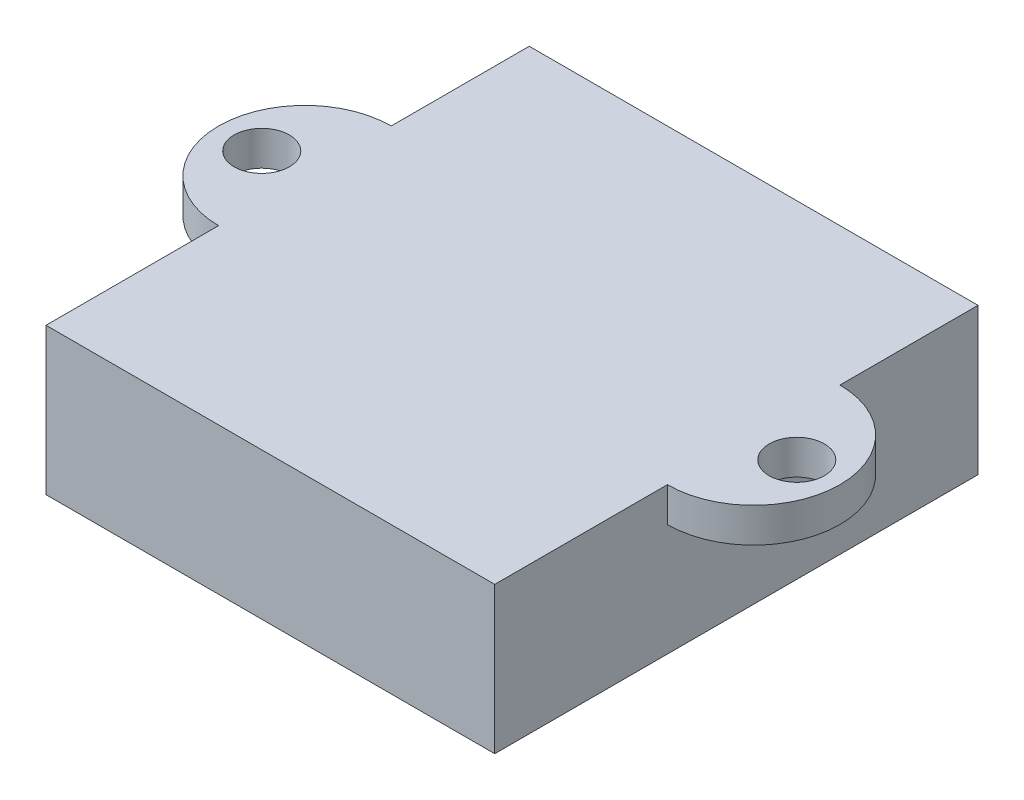
ISO-10303-21;
HEADER;
FILE_DESCRIPTION(('STEP AP214'),'2;1');
FILE_NAME('part.step','',(''),(''),'','','');
FILE_SCHEMA(('AUTOMOTIVE_DESIGN { 1 0 10303 214 1 1 1 1 }'));
ENDSEC;
DATA;
#1=APPLICATION_CONTEXT('core data for automotive mechanical design processes');
#2=APPLICATION_PROTOCOL_DEFINITION('international standard','automotive_design',2000,#1);
#3=PRODUCT_CONTEXT('',#1,'mechanical');
#4=PRODUCT('Part','Part','',(#3));
#5=PRODUCT_RELATED_PRODUCT_CATEGORY('part','',(#4));
#6=PRODUCT_DEFINITION_FORMATION('','',#4);
#7=PRODUCT_DEFINITION_CONTEXT('part definition',#1,'design');
#8=PRODUCT_DEFINITION('design','',#6,#7);
#9=PRODUCT_DEFINITION_SHAPE('','',#8);
#10=(LENGTH_UNIT() NAMED_UNIT(*) SI_UNIT(.MILLI.,.METRE.));
#11=(NAMED_UNIT(*) PLANE_ANGLE_UNIT() SI_UNIT($,.RADIAN.));
#12=(NAMED_UNIT(*) SI_UNIT($,.STERADIAN.) SOLID_ANGLE_UNIT());
#13=UNCERTAINTY_MEASURE_WITH_UNIT(LENGTH_MEASURE(1.E-05),#10,'distance_accuracy_value','');
#14=(GEOMETRIC_REPRESENTATION_CONTEXT(3) GLOBAL_UNCERTAINTY_ASSIGNED_CONTEXT((#13)) GLOBAL_UNIT_ASSIGNED_CONTEXT((#10,
#11,#12)) REPRESENTATION_CONTEXT('',''));
#15=CARTESIAN_POINT('',(0.,0.,0.));
#16=DIRECTION('',(0.,0.,1.));
#17=DIRECTION('',(1.,0.,0.));
#18=AXIS2_PLACEMENT_3D('',#15,#16,#17);
#19=CARTESIAN_POINT('',(13.,8.5,14.));
#20=DIRECTION('',(-1.,0.,0.));
#21=DIRECTION('',(0.,0.,1.));
#22=AXIS2_PLACEMENT_3D('',#19,#20,#21);
#23=PLANE('',#22);
#24=DIRECTION('',(0.,0.,-1.));
#25=VECTOR('',#24,1.);
#26=CARTESIAN_POINT('',(13.,6.5,14.));
#27=LINE('',#26,#25);
#28=CARTESIAN_POINT('',(13.,6.5,4.));
#29=VERTEX_POINT('',#28);
#30=CARTESIAN_POINT('',(13.,6.5,-6.));
#31=VERTEX_POINT('',#30);
#32=EDGE_CURVE('E11',#29,#31,#27,.T.);
#33=ORIENTED_EDGE('',*,*,#32,.F.);
#34=DIRECTION('',(0.,1.,0.));
#35=VECTOR('',#34,1.);
#36=CARTESIAN_POINT('',(13.,6.5,4.));
#37=LINE('',#36,#35);
#38=CARTESIAN_POINT('',(13.,8.5,4.));
#39=VERTEX_POINT('',#38);
#40=EDGE_CURVE('E103',#29,#39,#37,.T.);
#41=ORIENTED_EDGE('',*,*,#40,.T.);
#42=DIRECTION('',(0.,0.,-1.));
#43=VECTOR('',#42,1.);
#44=CARTESIAN_POINT('',(13.,8.5,14.));
#45=LINE('',#44,#43);
#46=CARTESIAN_POINT('',(13.,8.5,14.));
#47=VERTEX_POINT('',#46);
#48=EDGE_CURVE('E134',#47,#39,#45,.T.);
#49=ORIENTED_EDGE('',*,*,#48,.F.);
#50=DIRECTION('',(0.,-1.,0.));
#51=VECTOR('',#50,1.);
#52=CARTESIAN_POINT('',(13.,8.5,14.));
#53=LINE('',#52,#51);
#54=CARTESIAN_POINT('',(13.,0.,14.));
#55=VERTEX_POINT('',#54);
#56=EDGE_CURVE('E143',#47,#55,#53,.T.);
#57=ORIENTED_EDGE('',*,*,#56,.T.);
#58=DIRECTION('',(0.,0.,-1.));
#59=VECTOR('',#58,1.);
#60=CARTESIAN_POINT('',(13.,0.,14.));
#61=LINE('',#60,#59);
#62=CARTESIAN_POINT('',(13.,0.,-14.));
#63=VERTEX_POINT('',#62);
#64=EDGE_CURVE('E133',#55,#63,#61,.T.);
#65=ORIENTED_EDGE('',*,*,#64,.T.);
#66=DIRECTION('',(0.,-1.,0.));
#67=VECTOR('',#66,1.);
#68=CARTESIAN_POINT('',(13.,8.5,-14.));
#69=LINE('',#68,#67);
#70=CARTESIAN_POINT('',(13.,8.5,-14.));
#71=VERTEX_POINT('',#70);
#72=EDGE_CURVE('E160',#71,#63,#69,.T.);
#73=ORIENTED_EDGE('',*,*,#72,.F.);
#74=CARTESIAN_POINT('',(13.,8.5,-6.));
#75=VERTEX_POINT('',#74);
#76=EDGE_CURVE('E119',#75,#71,#45,.T.);
#77=ORIENTED_EDGE('',*,*,#76,.F.);
#78=DIRECTION('',(0.,1.,0.));
#79=VECTOR('',#78,1.);
#80=CARTESIAN_POINT('',(13.,6.5,-6.));
#81=LINE('',#80,#79);
#82=EDGE_CURVE('E111',#75,#31,#81,.F.);
#83=ORIENTED_EDGE('',*,*,#82,.T.);
#84=EDGE_LOOP('',(#33,#41,#49,#57,#65,#73,#77,#83));
#85=FACE_BOUND('',#84,.T.);
#86=ADVANCED_FACE('F39',(#85),#23,.F.);
#87=CARTESIAN_POINT('',(-13.,8.5,-14.));
#88=DIRECTION('',(0.,0.,1.));
#89=DIRECTION('',(1.,0.,0.));
#90=AXIS2_PLACEMENT_3D('',#87,#88,#89);
#91=PLANE('',#90);
#92=DIRECTION('',(-1.,0.,0.));
#93=VECTOR('',#92,1.);
#94=CARTESIAN_POINT('',(-13.,0.,-14.));
#95=LINE('',#94,#93);
#96=CARTESIAN_POINT('',(-13.,0.,-14.));
#97=VERTEX_POINT('',#96);
#98=EDGE_CURVE('E146',#63,#97,#95,.T.);
#99=ORIENTED_EDGE('',*,*,#98,.T.);
#100=DIRECTION('',(0.,-1.,0.));
#101=VECTOR('',#100,1.);
#102=CARTESIAN_POINT('',(-13.,8.5,-14.));
#103=LINE('',#102,#101);
#104=CARTESIAN_POINT('',(-13.,8.5,-14.));
#105=VERTEX_POINT('',#104);
#106=EDGE_CURVE('E157',#105,#97,#103,.T.);
#107=ORIENTED_EDGE('',*,*,#106,.F.);
#108=DIRECTION('',(-1.,0.,0.));
#109=VECTOR('',#108,1.);
#110=CARTESIAN_POINT('',(-13.,8.5,-14.));
#111=LINE('',#110,#109);
#112=EDGE_CURVE('E136',#71,#105,#111,.T.);
#113=ORIENTED_EDGE('',*,*,#112,.F.);
#114=ORIENTED_EDGE('',*,*,#72,.T.);
#115=EDGE_LOOP('',(#99,#107,#113,#114));
#116=FACE_BOUND('',#115,.T.);
#117=ADVANCED_FACE('F196',(#116),#91,.F.);
#118=CARTESIAN_POINT('',(-13.,8.5,14.));
#119=DIRECTION('',(1.,0.,0.));
#120=DIRECTION('',(0.,0.,-1.));
#121=AXIS2_PLACEMENT_3D('',#118,#119,#120);
#122=PLANE('',#121);
#123=DIRECTION('',(0.,0.,1.));
#124=VECTOR('',#123,1.);
#125=CARTESIAN_POINT('',(-13.,6.5,14.));
#126=LINE('',#125,#124);
#127=CARTESIAN_POINT('',(-13.,6.5,-6.));
#128=VERTEX_POINT('',#127);
#129=CARTESIAN_POINT('',(-13.,6.5,4.));
#130=VERTEX_POINT('',#129);
#131=EDGE_CURVE('E47',#128,#130,#126,.T.);
#132=ORIENTED_EDGE('',*,*,#131,.F.);
#133=DIRECTION('',(0.,1.,0.));
#134=VECTOR('',#133,1.);
#135=CARTESIAN_POINT('',(-13.,6.5,-6.));
#136=LINE('',#135,#134);
#137=CARTESIAN_POINT('',(-13.,8.5,-6.));
#138=VERTEX_POINT('',#137);
#139=EDGE_CURVE('E130',#128,#138,#136,.T.);
#140=ORIENTED_EDGE('',*,*,#139,.T.);
#141=DIRECTION('',(0.,0.,1.));
#142=VECTOR('',#141,1.);
#143=CARTESIAN_POINT('',(-13.,8.5,14.));
#144=LINE('',#143,#142);
#145=EDGE_CURVE('E139',#105,#138,#144,.T.);
#146=ORIENTED_EDGE('',*,*,#145,.F.);
#147=ORIENTED_EDGE('',*,*,#106,.T.);
#148=DIRECTION('',(0.,0.,1.));
#149=VECTOR('',#148,1.);
#150=CARTESIAN_POINT('',(-13.,0.,14.));
#151=LINE('',#150,#149);
#152=CARTESIAN_POINT('',(-13.,0.,14.));
#153=VERTEX_POINT('',#152);
#154=EDGE_CURVE('E148',#97,#153,#151,.T.);
#155=ORIENTED_EDGE('',*,*,#154,.T.);
#156=DIRECTION('',(0.,-1.,0.));
#157=VECTOR('',#156,1.);
#158=CARTESIAN_POINT('',(-13.,8.5,14.));
#159=LINE('',#158,#157);
#160=CARTESIAN_POINT('',(-13.,8.5,14.));
#161=VERTEX_POINT('',#160);
#162=EDGE_CURVE('E154',#161,#153,#159,.T.);
#163=ORIENTED_EDGE('',*,*,#162,.F.);
#164=CARTESIAN_POINT('',(-13.,8.5,4.));
#165=VERTEX_POINT('',#164);
#166=EDGE_CURVE('E138',#165,#161,#144,.T.);
#167=ORIENTED_EDGE('',*,*,#166,.F.);
#168=DIRECTION('',(0.,1.,0.));
#169=VECTOR('',#168,1.);
#170=CARTESIAN_POINT('',(-13.,6.5,4.));
#171=LINE('',#170,#169);
#172=EDGE_CURVE('E126',#165,#130,#171,.F.);
#173=ORIENTED_EDGE('',*,*,#172,.T.);
#174=EDGE_LOOP('',(#132,#140,#146,#147,#155,#163,#167,#173));
#175=FACE_BOUND('',#174,.T.);
#176=ADVANCED_FACE('F200',(#175),#122,.F.);
#177=CARTESIAN_POINT('',(-13.,8.5,14.));
#178=DIRECTION('',(0.,0.,-1.));
#179=DIRECTION('',(-1.,0.,0.));
#180=AXIS2_PLACEMENT_3D('',#177,#178,#179);
#181=PLANE('',#180);
#182=DIRECTION('',(1.,0.,0.));
#183=VECTOR('',#182,1.);
#184=CARTESIAN_POINT('',(-13.,0.,14.));
#185=LINE('',#184,#183);
#186=EDGE_CURVE('E150',#153,#55,#185,.T.);
#187=ORIENTED_EDGE('',*,*,#186,.T.);
#188=ORIENTED_EDGE('',*,*,#56,.F.);
#189=DIRECTION('',(1.,0.,0.));
#190=VECTOR('',#189,1.);
#191=CARTESIAN_POINT('',(-13.,8.5,14.));
#192=LINE('',#191,#190);
#193=EDGE_CURVE('E141',#161,#47,#192,.T.);
#194=ORIENTED_EDGE('',*,*,#193,.F.);
#195=ORIENTED_EDGE('',*,*,#162,.T.);
#196=EDGE_LOOP('',(#187,#188,#194,#195));
#197=FACE_BOUND('',#196,.T.);
#198=ADVANCED_FACE('F184',(#197),#181,.F.);
#199=CARTESIAN_POINT('',(0.,8.5,0.));
#200=DIRECTION('',(0.,-1.,0.));
#201=DIRECTION('',(0.,0.,-1.));
#202=AXIS2_PLACEMENT_3D('',#199,#200,#201);
#203=PLANE('',#202);
#204=CARTESIAN_POINT('',(-15.5,8.5,-0.999999999999997));
#205=DIRECTION('',(0.,1.,0.));
#206=DIRECTION('',(0.,0.,1.));
#207=AXIS2_PLACEMENT_3D('',#204,#205,#206);
#208=CIRCLE('',#207,1.6);
#209=CARTESIAN_POINT('',(-15.5,8.5,0.600000000000002));
#210=VERTEX_POINT('',#209);
#211=EDGE_CURVE('E172',#210,#210,#208,.T.);
#212=ORIENTED_EDGE('',*,*,#211,.F.);
#213=EDGE_LOOP('',(#212));
#214=FACE_BOUND('',#213,.T.);
#215=CARTESIAN_POINT('',(15.5,8.5,-0.999999999999997));
#216=DIRECTION('',(0.,1.,0.));
#217=DIRECTION('',(0.,0.,1.));
#218=AXIS2_PLACEMENT_3D('',#215,#216,#217);
#219=CIRCLE('',#218,1.6);
#220=CARTESIAN_POINT('',(15.5,8.5,0.6));
#221=VERTEX_POINT('',#220);
#222=EDGE_CURVE('E164',#221,#221,#219,.T.);
#223=ORIENTED_EDGE('',*,*,#222,.F.);
#224=EDGE_LOOP('',(#223));
#225=FACE_BOUND('',#224,.T.);
#226=ORIENTED_EDGE('',*,*,#48,.T.);
#227=CARTESIAN_POINT('',(13.,8.5,-0.999999999999997));
#228=DIRECTION('',(0.,1.,0.));
#229=DIRECTION('',(0.,0.,1.));
#230=AXIS2_PLACEMENT_3D('',#227,#228,#229);
#231=CIRCLE('',#230,5.);
#232=EDGE_CURVE('E55',#39,#75,#231,.T.);
#233=ORIENTED_EDGE('',*,*,#232,.T.);
#234=ORIENTED_EDGE('',*,*,#76,.T.);
#235=ORIENTED_EDGE('',*,*,#112,.T.);
#236=ORIENTED_EDGE('',*,*,#145,.T.);
#237=CARTESIAN_POINT('',(-13.,8.5,-0.999999999999997));
#238=DIRECTION('',(0.,1.,0.));
#239=DIRECTION('',(0.,0.,1.));
#240=AXIS2_PLACEMENT_3D('',#237,#238,#239);
#241=CIRCLE('',#240,5.);
#242=EDGE_CURVE('E62',#138,#165,#241,.T.);
#243=ORIENTED_EDGE('',*,*,#242,.T.);
#244=ORIENTED_EDGE('',*,*,#166,.T.);
#245=ORIENTED_EDGE('',*,*,#193,.T.);
#246=EDGE_LOOP('',(#226,#233,#234,#235,#236,#243,#244,#245));
#247=FACE_BOUND('',#246,.T.);
#248=ADVANCED_FACE('F180',(#214,#225,#247),#203,.F.);
#249=CARTESIAN_POINT('',(0.,0.,0.));
#250=DIRECTION('',(0.,-1.,0.));
#251=DIRECTION('',(0.,0.,-1.));
#252=AXIS2_PLACEMENT_3D('',#249,#250,#251);
#253=PLANE('',#252);
#254=ORIENTED_EDGE('',*,*,#64,.F.);
#255=ORIENTED_EDGE('',*,*,#186,.F.);
#256=ORIENTED_EDGE('',*,*,#154,.F.);
#257=ORIENTED_EDGE('',*,*,#98,.F.);
#258=EDGE_LOOP('',(#254,#255,#256,#257));
#259=FACE_BOUND('',#258,.T.);
#260=ADVANCED_FACE('F183',(#259),#253,.T.);
#261=CARTESIAN_POINT('',(-13.,6.5,-0.999999999999997));
#262=DIRECTION('',(0.,1.,0.));
#263=DIRECTION('',(0.,0.,1.));
#264=AXIS2_PLACEMENT_3D('',#261,#262,#263);
#265=PLANE('',#264);
#266=CARTESIAN_POINT('',(-15.5,6.5,-0.999999999999997));
#267=DIRECTION('',(0.,1.,0.));
#268=DIRECTION('',(0.,0.,1.));
#269=AXIS2_PLACEMENT_3D('',#266,#267,#268);
#270=CIRCLE('',#269,1.6);
#271=CARTESIAN_POINT('',(-15.5,6.5,0.600000000000001));
#272=VERTEX_POINT('',#271);
#273=EDGE_CURVE('E42',#272,#272,#270,.T.);
#274=ORIENTED_EDGE('',*,*,#273,.T.);
#275=EDGE_LOOP('',(#274));
#276=FACE_BOUND('',#275,.T.);
#277=CARTESIAN_POINT('',(-13.,6.5,-0.999999999999997));
#278=DIRECTION('',(0.,1.,0.));
#279=DIRECTION('',(0.,0.,1.));
#280=AXIS2_PLACEMENT_3D('',#277,#278,#279);
#281=CIRCLE('',#280,5.);
#282=EDGE_CURVE('E123',#128,#130,#281,.T.);
#283=ORIENTED_EDGE('',*,*,#282,.F.);
#284=ORIENTED_EDGE('',*,*,#131,.T.);
#285=EDGE_LOOP('',(#283,#284));
#286=FACE_BOUND('',#285,.T.);
#287=ADVANCED_FACE('F205',(#276,#286),#265,.F.);
#288=CARTESIAN_POINT('',(-13.,6.5,-0.999999999999997));
#289=DIRECTION('',(0.,1.,0.));
#290=DIRECTION('',(0.,0.,1.));
#291=AXIS2_PLACEMENT_3D('',#288,#289,#290);
#292=CYLINDRICAL_SURFACE('',#291,5.);
#293=ORIENTED_EDGE('',*,*,#139,.F.);
#294=ORIENTED_EDGE('',*,*,#282,.T.);
#295=ORIENTED_EDGE('',*,*,#172,.F.);
#296=ORIENTED_EDGE('',*,*,#242,.F.);
#297=EDGE_LOOP('',(#293,#294,#295,#296));
#298=FACE_BOUND('',#297,.T.);
#299=ADVANCED_FACE('F203',(#298),#292,.T.);
#300=CARTESIAN_POINT('',(13.,6.5,-0.999999999999997));
#301=DIRECTION('',(0.,1.,0.));
#302=DIRECTION('',(0.,0.,1.));
#303=AXIS2_PLACEMENT_3D('',#300,#301,#302);
#304=PLANE('',#303);
#305=CARTESIAN_POINT('',(15.5,6.5,-0.999999999999997));
#306=DIRECTION('',(0.,1.,0.));
#307=DIRECTION('',(0.,0.,1.));
#308=AXIS2_PLACEMENT_3D('',#305,#306,#307);
#309=CIRCLE('',#308,1.6);
#310=CARTESIAN_POINT('',(15.5,6.5,0.6));
#311=VERTEX_POINT('',#310);
#312=EDGE_CURVE('E115',#311,#311,#309,.T.);
#313=ORIENTED_EDGE('',*,*,#312,.T.);
#314=EDGE_LOOP('',(#313));
#315=FACE_BOUND('',#314,.T.);
#316=CARTESIAN_POINT('',(13.,6.5,-0.999999999999997));
#317=DIRECTION('',(0.,1.,0.));
#318=DIRECTION('',(0.,0.,1.));
#319=AXIS2_PLACEMENT_3D('',#316,#317,#318);
#320=CIRCLE('',#319,5.);
#321=EDGE_CURVE('E106',#29,#31,#320,.T.);
#322=ORIENTED_EDGE('',*,*,#321,.F.);
#323=ORIENTED_EDGE('',*,*,#32,.T.);
#324=EDGE_LOOP('',(#322,#323));
#325=FACE_BOUND('',#324,.T.);
#326=ADVANCED_FACE('F114',(#315,#325),#304,.F.);
#327=CARTESIAN_POINT('',(13.,6.5,-0.999999999999997));
#328=DIRECTION('',(0.,1.,0.));
#329=DIRECTION('',(0.,0.,1.));
#330=AXIS2_PLACEMENT_3D('',#327,#328,#329);
#331=CYLINDRICAL_SURFACE('',#330,5.);
#332=ORIENTED_EDGE('',*,*,#40,.F.);
#333=ORIENTED_EDGE('',*,*,#321,.T.);
#334=ORIENTED_EDGE('',*,*,#82,.F.);
#335=ORIENTED_EDGE('',*,*,#232,.F.);
#336=EDGE_LOOP('',(#332,#333,#334,#335));
#337=FACE_BOUND('',#336,.T.);
#338=ADVANCED_FACE('F105',(#337),#331,.T.);
#339=CARTESIAN_POINT('',(15.5,8.5,-0.999999999999997));
#340=DIRECTION('',(0.,1.,0.));
#341=DIRECTION('',(0.,0.,1.));
#342=AXIS2_PLACEMENT_3D('',#339,#340,#341);
#343=CYLINDRICAL_SURFACE('',#342,1.6);
#344=ORIENTED_EDGE('',*,*,#222,.T.);
#345=EDGE_LOOP('',(#344));
#346=FACE_BOUND('',#345,.T.);
#347=ORIENTED_EDGE('',*,*,#312,.F.);
#348=EDGE_LOOP('',(#347));
#349=FACE_BOUND('',#348,.T.);
#350=ADVANCED_FACE('F275',(#346,#349),#343,.F.);
#351=CARTESIAN_POINT('',(-15.5,8.5,-0.999999999999997));
#352=DIRECTION('',(0.,1.,0.));
#353=DIRECTION('',(0.,0.,1.));
#354=AXIS2_PLACEMENT_3D('',#351,#352,#353);
#355=CYLINDRICAL_SURFACE('',#354,1.6);
#356=ORIENTED_EDGE('',*,*,#211,.T.);
#357=EDGE_LOOP('',(#356));
#358=FACE_BOUND('',#357,.T.);
#359=ORIENTED_EDGE('',*,*,#273,.F.);
#360=EDGE_LOOP('',(#359));
#361=FACE_BOUND('',#360,.T.);
#362=ADVANCED_FACE('F177',(#358,#361),#355,.F.);
#363=CLOSED_SHELL('',(#86,#117,#176,#198,#248,#260,#287,#299,#326,#338,#350,#362));
#364=MANIFOLD_SOLID_BREP('B2',#363);
#365=ADVANCED_BREP_SHAPE_REPRESENTATION('',(#18,#364),#14);
#366=SHAPE_DEFINITION_REPRESENTATION(#9,#365);
ENDSEC;
END-ISO-10303-21;
